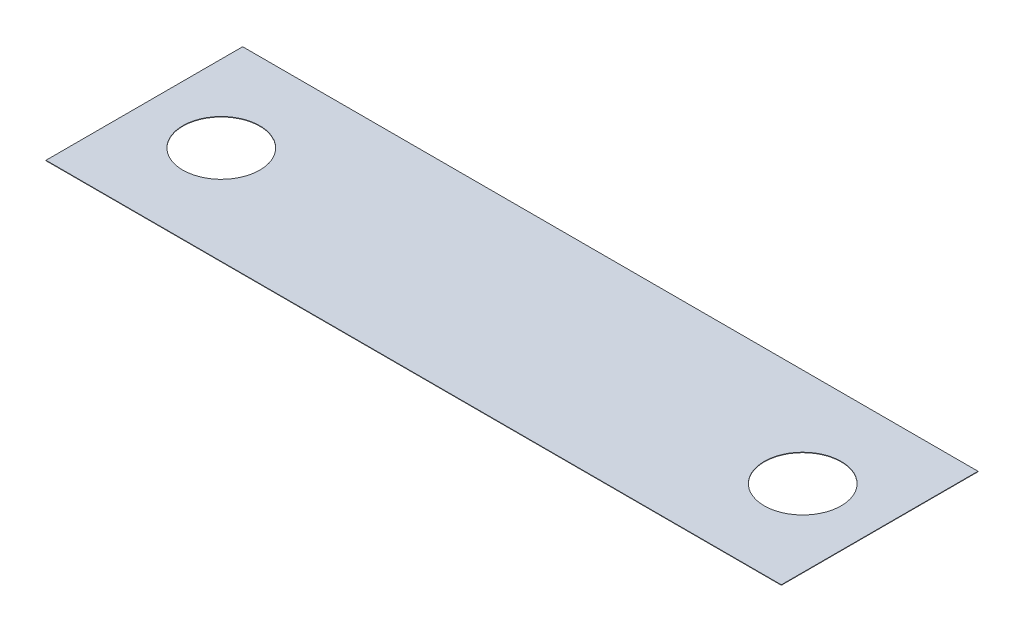
ISO-10303-21;
HEADER;
FILE_DESCRIPTION(('STEP AP214'),'2;1');
FILE_NAME('part.step','',(''),(''),'','','');
FILE_SCHEMA(('AUTOMOTIVE_DESIGN { 1 0 10303 214 1 1 1 1 }'));
ENDSEC;
DATA;
#1=APPLICATION_CONTEXT('core data for automotive mechanical design processes');
#2=APPLICATION_PROTOCOL_DEFINITION('international standard','automotive_design',2000,#1);
#3=PRODUCT_CONTEXT('',#1,'mechanical');
#4=PRODUCT('Part','Part','',(#3));
#5=PRODUCT_RELATED_PRODUCT_CATEGORY('part','',(#4));
#6=PRODUCT_DEFINITION_FORMATION('','',#4);
#7=PRODUCT_DEFINITION_CONTEXT('part definition',#1,'design');
#8=PRODUCT_DEFINITION('design','',#6,#7);
#9=PRODUCT_DEFINITION_SHAPE('','',#8);
#10=(LENGTH_UNIT() NAMED_UNIT(*) SI_UNIT(.MILLI.,.METRE.));
#11=(NAMED_UNIT(*) PLANE_ANGLE_UNIT() SI_UNIT($,.RADIAN.));
#12=(NAMED_UNIT(*) SI_UNIT($,.STERADIAN.) SOLID_ANGLE_UNIT());
#13=UNCERTAINTY_MEASURE_WITH_UNIT(LENGTH_MEASURE(1.E-05),#10,'distance_accuracy_value','');
#14=(GEOMETRIC_REPRESENTATION_CONTEXT(3) GLOBAL_UNCERTAINTY_ASSIGNED_CONTEXT((#13)) GLOBAL_UNIT_ASSIGNED_CONTEXT((#10,
#11,#12)) REPRESENTATION_CONTEXT('',''));
#15=CARTESIAN_POINT('',(0.,0.,0.));
#16=DIRECTION('',(0.,0.,1.));
#17=DIRECTION('',(1.,0.,0.));
#18=AXIS2_PLACEMENT_3D('',#15,#16,#17);
#19=CARTESIAN_POINT('',(0.,0.0507999999999897,0.));
#20=DIRECTION('',(1.,0.,0.));
#21=DIRECTION('',(0.,0.,-1.));
#22=AXIS2_PLACEMENT_3D('',#19,#20,#21);
#23=PLANE('',#22);
#24=DIRECTION('',(0.,0.,1.));
#25=VECTOR('',#24,1.);
#26=CARTESIAN_POINT('',(0.,0.,0.));
#27=LINE('',#26,#25);
#28=CARTESIAN_POINT('',(0.,0.,-22.9999999999999));
#29=VERTEX_POINT('',#28);
#30=CARTESIAN_POINT('',(0.,0.,0.));
#31=VERTEX_POINT('',#30);
#32=EDGE_CURVE('E99',#29,#31,#27,.T.);
#33=ORIENTED_EDGE('',*,*,#32,.T.);
#34=DIRECTION('',(0.,-1.,0.));
#35=VECTOR('',#34,1.);
#36=CARTESIAN_POINT('',(0.,0.0507999999999897,0.));
#37=LINE('',#36,#35);
#38=CARTESIAN_POINT('',(0.,0.0507999999999897,0.));
#39=VERTEX_POINT('',#38);
#40=EDGE_CURVE('E11',#39,#31,#37,.T.);
#41=ORIENTED_EDGE('',*,*,#40,.F.);
#42=DIRECTION('',(0.,0.,1.));
#43=VECTOR('',#42,1.);
#44=CARTESIAN_POINT('',(0.,0.0507999999999897,0.));
#45=LINE('',#44,#43);
#46=CARTESIAN_POINT('',(0.,0.0508000000000175,-22.9999999999999));
#47=VERTEX_POINT('',#46);
#48=EDGE_CURVE('E87',#47,#39,#45,.T.);
#49=ORIENTED_EDGE('',*,*,#48,.F.);
#50=DIRECTION('',(0.,-1.,0.));
#51=VECTOR('',#50,1.);
#52=CARTESIAN_POINT('',(0.,0.0508000000000175,-22.9999999999999));
#53=LINE('',#52,#51);
#54=EDGE_CURVE('E95',#47,#29,#53,.T.);
#55=ORIENTED_EDGE('',*,*,#54,.T.);
#56=EDGE_LOOP('',(#33,#41,#49,#55));
#57=FACE_BOUND('',#56,.T.);
#58=ADVANCED_FACE('F36',(#57),#23,.F.);
#59=CARTESIAN_POINT('',(0.,0.0507999999999897,0.));
#60=DIRECTION('',(0.,0.,-1.));
#61=DIRECTION('',(-1.,0.,0.));
#62=AXIS2_PLACEMENT_3D('',#59,#60,#61);
#63=PLANE('',#62);
#64=DIRECTION('',(1.,0.,0.));
#65=VECTOR('',#64,1.);
#66=CARTESIAN_POINT('',(0.,0.,0.));
#67=LINE('',#66,#65);
#68=CARTESIAN_POINT('',(86.,0.,0.));
#69=VERTEX_POINT('',#68);
#70=EDGE_CURVE('E91',#31,#69,#67,.T.);
#71=ORIENTED_EDGE('',*,*,#70,.T.);
#72=DIRECTION('',(0.,-1.,0.));
#73=VECTOR('',#72,1.);
#74=CARTESIAN_POINT('',(86.,0.0507999999999897,0.));
#75=LINE('',#74,#73);
#76=CARTESIAN_POINT('',(86.,0.0507999999999897,0.));
#77=VERTEX_POINT('',#76);
#78=EDGE_CURVE('E44',#77,#69,#75,.T.);
#79=ORIENTED_EDGE('',*,*,#78,.F.);
#80=DIRECTION('',(1.,0.,0.));
#81=VECTOR('',#80,1.);
#82=CARTESIAN_POINT('',(0.,0.0507999999999897,0.));
#83=LINE('',#82,#81);
#84=EDGE_CURVE('E82',#39,#77,#83,.T.);
#85=ORIENTED_EDGE('',*,*,#84,.F.);
#86=ORIENTED_EDGE('',*,*,#40,.T.);
#87=EDGE_LOOP('',(#71,#79,#85,#86));
#88=FACE_BOUND('',#87,.T.);
#89=ADVANCED_FACE('F90',(#88),#63,.F.);
#90=CARTESIAN_POINT('',(86.,0.0507999999999897,0.));
#91=DIRECTION('',(-1.,0.,0.));
#92=DIRECTION('',(0.,0.,1.));
#93=AXIS2_PLACEMENT_3D('',#90,#91,#92);
#94=PLANE('',#93);
#95=DIRECTION('',(0.,0.,-1.));
#96=VECTOR('',#95,1.);
#97=CARTESIAN_POINT('',(86.,0.,0.));
#98=LINE('',#97,#96);
#99=CARTESIAN_POINT('',(86.,0.,-22.9999999999999));
#100=VERTEX_POINT('',#99);
#101=EDGE_CURVE('E69',#69,#100,#98,.T.);
#102=ORIENTED_EDGE('',*,*,#101,.T.);
#103=DIRECTION('',(0.,-1.,0.));
#104=VECTOR('',#103,1.);
#105=CARTESIAN_POINT('',(86.,0.0508000000000175,-22.9999999999999));
#106=LINE('',#105,#104);
#107=CARTESIAN_POINT('',(86.,0.0508000000000175,-22.9999999999999));
#108=VERTEX_POINT('',#107);
#109=EDGE_CURVE('E92',#108,#100,#106,.T.);
#110=ORIENTED_EDGE('',*,*,#109,.F.);
#111=DIRECTION('',(0.,0.,-1.));
#112=VECTOR('',#111,1.);
#113=CARTESIAN_POINT('',(86.,0.0507999999999897,0.));
#114=LINE('',#113,#112);
#115=EDGE_CURVE('E85',#77,#108,#114,.T.);
#116=ORIENTED_EDGE('',*,*,#115,.F.);
#117=ORIENTED_EDGE('',*,*,#78,.T.);
#118=EDGE_LOOP('',(#102,#110,#116,#117));
#119=FACE_BOUND('',#118,.T.);
#120=ADVANCED_FACE('F93',(#119),#94,.F.);
#121=CARTESIAN_POINT('',(0.,0.0508000000000175,-22.9999999999999));
#122=DIRECTION('',(0.,0.,1.));
#123=DIRECTION('',(1.,0.,0.));
#124=AXIS2_PLACEMENT_3D('',#121,#122,#123);
#125=PLANE('',#124);
#126=DIRECTION('',(-1.,0.,0.));
#127=VECTOR('',#126,1.);
#128=CARTESIAN_POINT('',(0.,0.,-22.9999999999999));
#129=LINE('',#128,#127);
#130=EDGE_CURVE('E75',#100,#29,#129,.T.);
#131=ORIENTED_EDGE('',*,*,#130,.T.);
#132=ORIENTED_EDGE('',*,*,#54,.F.);
#133=DIRECTION('',(-1.,0.,0.));
#134=VECTOR('',#133,1.);
#135=CARTESIAN_POINT('',(0.,0.0508000000000175,-22.9999999999999));
#136=LINE('',#135,#134);
#137=EDGE_CURVE('E52',#108,#47,#136,.T.);
#138=ORIENTED_EDGE('',*,*,#137,.F.);
#139=ORIENTED_EDGE('',*,*,#109,.T.);
#140=EDGE_LOOP('',(#131,#132,#138,#139));
#141=FACE_BOUND('',#140,.T.);
#142=ADVANCED_FACE('F107',(#141),#125,.F.);
#143=CARTESIAN_POINT('',(0.,0.0508000000000175,-22.9999999999999));
#144=DIRECTION('',(0.,-1.,0.));
#145=DIRECTION('',(0.,0.,-1.));
#146=AXIS2_PLACEMENT_3D('',#143,#144,#145);
#147=PLANE('',#146);
#148=CARTESIAN_POINT('',(8.99999999999999,0.0507999999999897,-11.5000000000001));
#149=DIRECTION('',(0.,1.,0.));
#150=DIRECTION('',(0.,0.,1.));
#151=AXIS2_PLACEMENT_3D('',#148,#149,#150);
#152=CIRCLE('',#151,4.49999999999999);
#153=CARTESIAN_POINT('',(8.99999999999999,0.0507999999999897,-7.00000000000007));
#154=VERTEX_POINT('',#153);
#155=EDGE_CURVE('E121',#154,#154,#152,.T.);
#156=ORIENTED_EDGE('',*,*,#155,.F.);
#157=EDGE_LOOP('',(#156));
#158=FACE_BOUND('',#157,.T.);
#159=CARTESIAN_POINT('',(77.,0.0507999999999897,-11.5000000000001));
#160=DIRECTION('',(0.,1.,0.));
#161=DIRECTION('',(0.,0.,1.));
#162=AXIS2_PLACEMENT_3D('',#159,#160,#161);
#163=CIRCLE('',#162,4.49999999999999);
#164=CARTESIAN_POINT('',(77.,0.0507999999999897,-7.00000000000007));
#165=VERTEX_POINT('',#164);
#166=EDGE_CURVE('E115',#165,#165,#163,.T.);
#167=ORIENTED_EDGE('',*,*,#166,.F.);
#168=EDGE_LOOP('',(#167));
#169=FACE_BOUND('',#168,.T.);
#170=ORIENTED_EDGE('',*,*,#48,.T.);
#171=ORIENTED_EDGE('',*,*,#84,.T.);
#172=ORIENTED_EDGE('',*,*,#115,.T.);
#173=ORIENTED_EDGE('',*,*,#137,.T.);
#174=EDGE_LOOP('',(#170,#171,#172,#173));
#175=FACE_BOUND('',#174,.T.);
#176=ADVANCED_FACE('F83',(#158,#169,#175),#147,.F.);
#177=CARTESIAN_POINT('',(0.,0.,-22.9999999999999));
#178=DIRECTION('',(0.,-1.,0.));
#179=DIRECTION('',(0.,0.,-1.));
#180=AXIS2_PLACEMENT_3D('',#177,#178,#179);
#181=PLANE('',#180);
#182=CARTESIAN_POINT('',(8.99999999999999,0.,-11.5000000000001));
#183=DIRECTION('',(0.,1.,0.));
#184=DIRECTION('',(0.,0.,1.));
#185=AXIS2_PLACEMENT_3D('',#182,#183,#184);
#186=CIRCLE('',#185,4.5);
#187=CARTESIAN_POINT('',(8.99999999999999,0.,-7.00000000000006));
#188=VERTEX_POINT('',#187);
#189=EDGE_CURVE('E118',#188,#188,#186,.T.);
#190=ORIENTED_EDGE('',*,*,#189,.T.);
#191=EDGE_LOOP('',(#190));
#192=FACE_BOUND('',#191,.T.);
#193=CARTESIAN_POINT('',(77.,0.,-11.5000000000001));
#194=DIRECTION('',(0.,1.,0.));
#195=DIRECTION('',(0.,0.,1.));
#196=AXIS2_PLACEMENT_3D('',#193,#194,#195);
#197=CIRCLE('',#196,4.5);
#198=CARTESIAN_POINT('',(77.,0.,-7.00000000000006));
#199=VERTEX_POINT('',#198);
#200=EDGE_CURVE('E102',#199,#199,#197,.T.);
#201=ORIENTED_EDGE('',*,*,#200,.T.);
#202=EDGE_LOOP('',(#201));
#203=FACE_BOUND('',#202,.T.);
#204=ORIENTED_EDGE('',*,*,#32,.F.);
#205=ORIENTED_EDGE('',*,*,#130,.F.);
#206=ORIENTED_EDGE('',*,*,#101,.F.);
#207=ORIENTED_EDGE('',*,*,#70,.F.);
#208=EDGE_LOOP('',(#204,#205,#206,#207));
#209=FACE_BOUND('',#208,.T.);
#210=ADVANCED_FACE('F110',(#192,#203,#209),#181,.T.);
#211=CARTESIAN_POINT('',(77.,0.0507999999999897,-11.5000000000001));
#212=DIRECTION('',(0.,1.,0.));
#213=DIRECTION('',(0.,0.,1.));
#214=AXIS2_PLACEMENT_3D('',#211,#212,#213);
#215=CYLINDRICAL_SURFACE('',#214,4.5);
#216=ORIENTED_EDGE('',*,*,#200,.F.);
#217=EDGE_LOOP('',(#216));
#218=FACE_BOUND('',#217,.T.);
#219=ORIENTED_EDGE('',*,*,#166,.T.);
#220=EDGE_LOOP('',(#219));
#221=FACE_BOUND('',#220,.T.);
#222=ADVANCED_FACE('F132',(#218,#221),#215,.F.);
#223=CARTESIAN_POINT('',(8.99999999999999,0.0507999999999897,-11.5000000000001));
#224=DIRECTION('',(0.,1.,0.));
#225=DIRECTION('',(0.,0.,1.));
#226=AXIS2_PLACEMENT_3D('',#223,#224,#225);
#227=CYLINDRICAL_SURFACE('',#226,4.49999999999999);
#228=ORIENTED_EDGE('',*,*,#189,.F.);
#229=EDGE_LOOP('',(#228));
#230=FACE_BOUND('',#229,.T.);
#231=ORIENTED_EDGE('',*,*,#155,.T.);
#232=EDGE_LOOP('',(#231));
#233=FACE_BOUND('',#232,.T.);
#234=ADVANCED_FACE('F125',(#230,#233),#227,.F.);
#235=CLOSED_SHELL('',(#58,#89,#120,#142,#176,#210,#222,#234));
#236=MANIFOLD_SOLID_BREP('B2',#235);
#237=ADVANCED_BREP_SHAPE_REPRESENTATION('',(#18,#236),#14);
#238=SHAPE_DEFINITION_REPRESENTATION(#9,#237);
ENDSEC;
END-ISO-10303-21;
